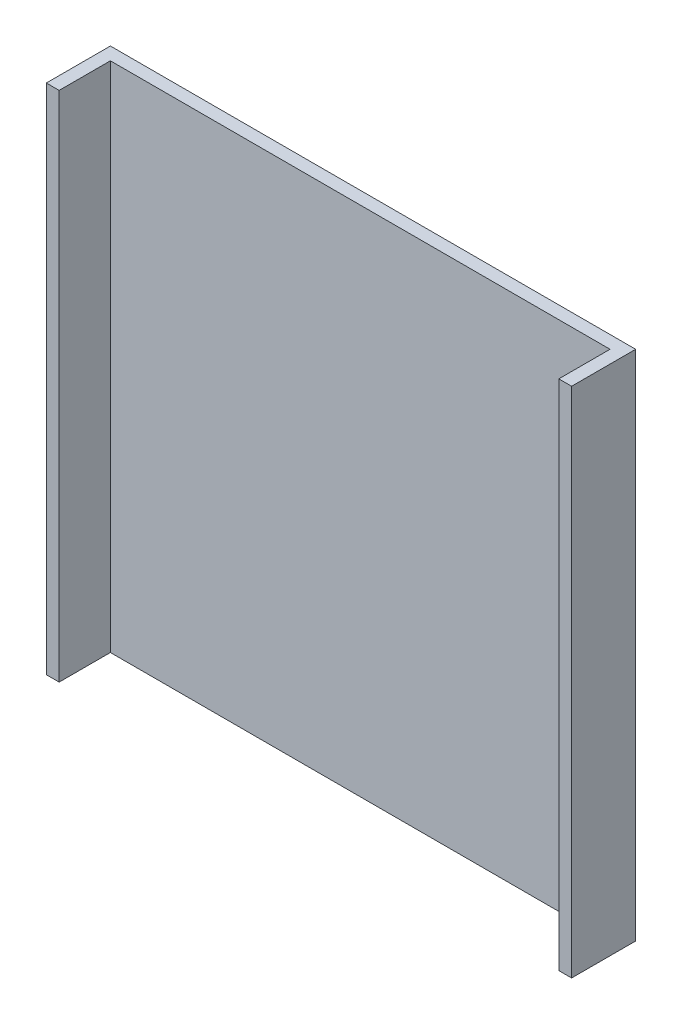
ISO-10303-21;
HEADER;
FILE_DESCRIPTION(('STEP AP214'),'2;1');
FILE_NAME('part.step','',(''),(''),'','','');
FILE_SCHEMA(('AUTOMOTIVE_DESIGN { 1 0 10303 214 1 1 1 1 }'));
ENDSEC;
DATA;
#1=APPLICATION_CONTEXT('core data for automotive mechanical design processes');
#2=APPLICATION_PROTOCOL_DEFINITION('international standard','automotive_design',2000,#1);
#3=PRODUCT_CONTEXT('',#1,'mechanical');
#4=PRODUCT('Part','Part','',(#3));
#5=PRODUCT_RELATED_PRODUCT_CATEGORY('part','',(#4));
#6=PRODUCT_DEFINITION_FORMATION('','',#4);
#7=PRODUCT_DEFINITION_CONTEXT('part definition',#1,'design');
#8=PRODUCT_DEFINITION('design','',#6,#7);
#9=PRODUCT_DEFINITION_SHAPE('','',#8);
#10=(LENGTH_UNIT() NAMED_UNIT(*) SI_UNIT(.MILLI.,.METRE.));
#11=(NAMED_UNIT(*) PLANE_ANGLE_UNIT() SI_UNIT($,.RADIAN.));
#12=(NAMED_UNIT(*) SI_UNIT($,.STERADIAN.) SOLID_ANGLE_UNIT());
#13=UNCERTAINTY_MEASURE_WITH_UNIT(LENGTH_MEASURE(1.E-05),#10,'distance_accuracy_value','');
#14=(GEOMETRIC_REPRESENTATION_CONTEXT(3) GLOBAL_UNCERTAINTY_ASSIGNED_CONTEXT((#13)) GLOBAL_UNIT_ASSIGNED_CONTEXT((#10,
#11,#12)) REPRESENTATION_CONTEXT('',''));
#15=CARTESIAN_POINT('',(0.,0.,0.));
#16=DIRECTION('',(0.,0.,1.));
#17=DIRECTION('',(1.,0.,0.));
#18=AXIS2_PLACEMENT_3D('',#15,#16,#17);
#19=CARTESIAN_POINT('',(0.,0.,6.35));
#20=DIRECTION('',(0.,0.,-1.));
#21=DIRECTION('',(-1.,0.,0.));
#22=AXIS2_PLACEMENT_3D('',#19,#20,#21);
#23=PLANE('',#22);
#24=DIRECTION('',(0.,-1.,0.));
#25=VECTOR('',#24,1.);
#26=CARTESIAN_POINT('',(254.,254.,6.35));
#27=LINE('',#26,#25);
#28=CARTESIAN_POINT('',(254.,254.,6.35));
#29=VERTEX_POINT('',#28);
#30=CARTESIAN_POINT('',(254.,0.,6.35));
#31=VERTEX_POINT('',#30);
#32=EDGE_CURVE('E138',#29,#31,#27,.T.);
#33=ORIENTED_EDGE('',*,*,#32,.F.);
#34=DIRECTION('',(-1.,0.,0.));
#35=VECTOR('',#34,1.);
#36=CARTESIAN_POINT('',(0.,254.,6.35));
#37=LINE('',#36,#35);
#38=CARTESIAN_POINT('',(6.35,254.,6.35));
#39=VERTEX_POINT('',#38);
#40=EDGE_CURVE('E180',#29,#39,#37,.T.);
#41=ORIENTED_EDGE('',*,*,#40,.T.);
#42=DIRECTION('',(0.,1.,0.));
#43=VECTOR('',#42,1.);
#44=CARTESIAN_POINT('',(6.35,254.,6.35));
#45=LINE('',#44,#43);
#46=CARTESIAN_POINT('',(6.35000000000002,0.,6.35));
#47=VERTEX_POINT('',#46);
#48=EDGE_CURVE('E66',#47,#39,#45,.T.);
#49=ORIENTED_EDGE('',*,*,#48,.F.);
#50=DIRECTION('',(1.,0.,0.));
#51=VECTOR('',#50,1.);
#52=CARTESIAN_POINT('',(0.,0.,6.35));
#53=LINE('',#52,#51);
#54=EDGE_CURVE('E61',#47,#31,#53,.T.);
#55=ORIENTED_EDGE('',*,*,#54,.T.);
#56=EDGE_LOOP('',(#33,#41,#49,#55));
#57=FACE_BOUND('',#56,.T.);
#58=ADVANCED_FACE('F45',(#57),#23,.F.);
#59=CARTESIAN_POINT('',(0.,0.,6.35));
#60=DIRECTION('',(1.,0.,0.));
#61=DIRECTION('',(0.,0.,-1.));
#62=AXIS2_PLACEMENT_3D('',#59,#60,#61);
#63=PLANE('',#62);
#64=DIRECTION('',(0.,-1.,0.));
#65=VECTOR('',#64,1.);
#66=CARTESIAN_POINT('',(0.,0.,0.));
#67=LINE('',#66,#65);
#68=CARTESIAN_POINT('',(0.,254.,0.));
#69=VERTEX_POINT('',#68);
#70=CARTESIAN_POINT('',(0.,0.,0.));
#71=VERTEX_POINT('',#70);
#72=EDGE_CURVE('E177',#69,#71,#67,.T.);
#73=ORIENTED_EDGE('',*,*,#72,.T.);
#74=DIRECTION('',(0.,0.,-1.));
#75=VECTOR('',#74,1.);
#76=CARTESIAN_POINT('',(0.,0.,6.35));
#77=LINE('',#76,#75);
#78=CARTESIAN_POINT('',(0.,0.,31.75));
#79=VERTEX_POINT('',#78);
#80=EDGE_CURVE('E11',#79,#71,#77,.T.);
#81=ORIENTED_EDGE('',*,*,#80,.F.);
#82=DIRECTION('',(0.,-1.,0.));
#83=VECTOR('',#82,1.);
#84=CARTESIAN_POINT('',(0.,254.,31.75));
#85=LINE('',#84,#83);
#86=CARTESIAN_POINT('',(0.,254.,31.75));
#87=VERTEX_POINT('',#86);
#88=EDGE_CURVE('E153',#87,#79,#85,.T.);
#89=ORIENTED_EDGE('',*,*,#88,.F.);
#90=DIRECTION('',(0.,0.,-1.));
#91=VECTOR('',#90,1.);
#92=CARTESIAN_POINT('',(0.,254.,6.35));
#93=LINE('',#92,#91);
#94=EDGE_CURVE('E121',#87,#69,#93,.T.);
#95=ORIENTED_EDGE('',*,*,#94,.T.);
#96=EDGE_LOOP('',(#73,#81,#89,#95));
#97=FACE_BOUND('',#96,.T.);
#98=ADVANCED_FACE('F47',(#97),#63,.F.);
#99=CARTESIAN_POINT('',(0.,0.,6.35));
#100=DIRECTION('',(0.,1.,0.));
#101=DIRECTION('',(0.,0.,1.));
#102=AXIS2_PLACEMENT_3D('',#99,#100,#101);
#103=PLANE('',#102);
#104=DIRECTION('',(1.,0.,0.));
#105=VECTOR('',#104,1.);
#106=CARTESIAN_POINT('',(0.,0.,0.));
#107=LINE('',#106,#105);
#108=CARTESIAN_POINT('',(260.35,0.,0.));
#109=VERTEX_POINT('',#108);
#110=EDGE_CURVE('E187',#71,#109,#107,.T.);
#111=ORIENTED_EDGE('',*,*,#110,.T.);
#112=DIRECTION('',(0.,0.,-1.));
#113=VECTOR('',#112,1.);
#114=CARTESIAN_POINT('',(260.35,0.,6.35));
#115=LINE('',#114,#113);
#116=CARTESIAN_POINT('',(260.35,0.,31.75));
#117=VERTEX_POINT('',#116);
#118=EDGE_CURVE('E54',#117,#109,#115,.T.);
#119=ORIENTED_EDGE('',*,*,#118,.F.);
#120=DIRECTION('',(1.,0.,0.));
#121=VECTOR('',#120,1.);
#122=CARTESIAN_POINT('',(260.35,0.,31.75));
#123=LINE('',#122,#121);
#124=CARTESIAN_POINT('',(254.,0.,31.75));
#125=VERTEX_POINT('',#124);
#126=EDGE_CURVE('E136',#125,#117,#123,.T.);
#127=ORIENTED_EDGE('',*,*,#126,.F.);
#128=DIRECTION('',(0.,0.,-1.));
#129=VECTOR('',#128,1.);
#130=CARTESIAN_POINT('',(254.,0.,31.75));
#131=LINE('',#130,#129);
#132=EDGE_CURVE('E146',#125,#31,#131,.T.);
#133=ORIENTED_EDGE('',*,*,#132,.T.);
#134=ORIENTED_EDGE('',*,*,#54,.F.);
#135=DIRECTION('',(0.,0.,-1.));
#136=VECTOR('',#135,1.);
#137=CARTESIAN_POINT('',(6.35000000000003,0.,31.75));
#138=LINE('',#137,#136);
#139=CARTESIAN_POINT('',(6.35000000000003,0.,31.75));
#140=VERTEX_POINT('',#139);
#141=EDGE_CURVE('E173',#140,#47,#138,.T.);
#142=ORIENTED_EDGE('',*,*,#141,.F.);
#143=DIRECTION('',(1.,0.,0.));
#144=VECTOR('',#143,1.);
#145=CARTESIAN_POINT('',(0.,0.,31.75));
#146=LINE('',#145,#144);
#147=EDGE_CURVE('E157',#79,#140,#146,.T.);
#148=ORIENTED_EDGE('',*,*,#147,.F.);
#149=ORIENTED_EDGE('',*,*,#80,.T.);
#150=EDGE_LOOP('',(#111,#119,#127,#133,#134,#142,#148,#149));
#151=FACE_BOUND('',#150,.T.);
#152=ADVANCED_FACE('F212',(#151),#103,.F.);
#153=CARTESIAN_POINT('',(260.35,0.,6.35));
#154=DIRECTION('',(-1.,0.,0.));
#155=DIRECTION('',(0.,0.,1.));
#156=AXIS2_PLACEMENT_3D('',#153,#154,#155);
#157=PLANE('',#156);
#158=DIRECTION('',(0.,1.,0.));
#159=VECTOR('',#158,1.);
#160=CARTESIAN_POINT('',(260.35,0.,0.));
#161=LINE('',#160,#159);
#162=CARTESIAN_POINT('',(260.35,254.,0.));
#163=VERTEX_POINT('',#162);
#164=EDGE_CURVE('E117',#109,#163,#161,.T.);
#165=ORIENTED_EDGE('',*,*,#164,.T.);
#166=DIRECTION('',(0.,0.,-1.));
#167=VECTOR('',#166,1.);
#168=CARTESIAN_POINT('',(260.35,254.,6.35));
#169=LINE('',#168,#167);
#170=CARTESIAN_POINT('',(260.35,254.,31.75));
#171=VERTEX_POINT('',#170);
#172=EDGE_CURVE('E110',#171,#163,#169,.T.);
#173=ORIENTED_EDGE('',*,*,#172,.F.);
#174=DIRECTION('',(0.,1.,0.));
#175=VECTOR('',#174,1.);
#176=CARTESIAN_POINT('',(260.35,254.,31.75));
#177=LINE('',#176,#175);
#178=EDGE_CURVE('E115',#117,#171,#177,.T.);
#179=ORIENTED_EDGE('',*,*,#178,.F.);
#180=ORIENTED_EDGE('',*,*,#118,.T.);
#181=EDGE_LOOP('',(#165,#173,#179,#180));
#182=FACE_BOUND('',#181,.T.);
#183=ADVANCED_FACE('F112',(#182),#157,.F.);
#184=CARTESIAN_POINT('',(0.,254.,6.35));
#185=DIRECTION('',(0.,-1.,0.));
#186=DIRECTION('',(0.,0.,-1.));
#187=AXIS2_PLACEMENT_3D('',#184,#185,#186);
#188=PLANE('',#187);
#189=DIRECTION('',(-1.,0.,0.));
#190=VECTOR('',#189,1.);
#191=CARTESIAN_POINT('',(0.,254.,0.));
#192=LINE('',#191,#190);
#193=EDGE_CURVE('E181',#163,#69,#192,.T.);
#194=ORIENTED_EDGE('',*,*,#193,.T.);
#195=ORIENTED_EDGE('',*,*,#94,.F.);
#196=DIRECTION('',(-1.,0.,0.));
#197=VECTOR('',#196,1.);
#198=CARTESIAN_POINT('',(0.,254.,31.75));
#199=LINE('',#198,#197);
#200=CARTESIAN_POINT('',(6.35,254.,31.75));
#201=VERTEX_POINT('',#200);
#202=EDGE_CURVE('E163',#201,#87,#199,.T.);
#203=ORIENTED_EDGE('',*,*,#202,.F.);
#204=DIRECTION('',(0.,0.,-1.));
#205=VECTOR('',#204,1.);
#206=CARTESIAN_POINT('',(6.35,254.,31.75));
#207=LINE('',#206,#205);
#208=EDGE_CURVE('E167',#201,#39,#207,.T.);
#209=ORIENTED_EDGE('',*,*,#208,.T.);
#210=ORIENTED_EDGE('',*,*,#40,.F.);
#211=DIRECTION('',(0.,0.,-1.));
#212=VECTOR('',#211,1.);
#213=CARTESIAN_POINT('',(254.,254.,31.75));
#214=LINE('',#213,#212);
#215=CARTESIAN_POINT('',(254.,254.,31.75));
#216=VERTEX_POINT('',#215);
#217=EDGE_CURVE('E127',#216,#29,#214,.T.);
#218=ORIENTED_EDGE('',*,*,#217,.F.);
#219=DIRECTION('',(-1.,0.,0.));
#220=VECTOR('',#219,1.);
#221=CARTESIAN_POINT('',(260.35,254.,31.75));
#222=LINE('',#221,#220);
#223=EDGE_CURVE('E124',#171,#216,#222,.T.);
#224=ORIENTED_EDGE('',*,*,#223,.F.);
#225=ORIENTED_EDGE('',*,*,#172,.T.);
#226=EDGE_LOOP('',(#194,#195,#203,#209,#210,#218,#224,#225));
#227=FACE_BOUND('',#226,.T.);
#228=ADVANCED_FACE('F125',(#227),#188,.F.);
#229=CARTESIAN_POINT('',(0.,0.,0.));
#230=DIRECTION('',(0.,0.,-1.));
#231=DIRECTION('',(-1.,0.,0.));
#232=AXIS2_PLACEMENT_3D('',#229,#230,#231);
#233=PLANE('',#232);
#234=ORIENTED_EDGE('',*,*,#72,.F.);
#235=ORIENTED_EDGE('',*,*,#193,.F.);
#236=ORIENTED_EDGE('',*,*,#164,.F.);
#237=ORIENTED_EDGE('',*,*,#110,.F.);
#238=EDGE_LOOP('',(#234,#235,#236,#237));
#239=FACE_BOUND('',#238,.T.);
#240=ADVANCED_FACE('F200',(#239),#233,.T.);
#241=CARTESIAN_POINT('',(6.35,254.,31.75));
#242=DIRECTION('',(-1.,0.,0.));
#243=DIRECTION('',(0.,-1.,0.));
#244=AXIS2_PLACEMENT_3D('',#241,#242,#243);
#245=PLANE('',#244);
#246=ORIENTED_EDGE('',*,*,#48,.T.);
#247=ORIENTED_EDGE('',*,*,#208,.F.);
#248=DIRECTION('',(0.,1.,0.));
#249=VECTOR('',#248,1.);
#250=CARTESIAN_POINT('',(6.35,254.,31.75));
#251=LINE('',#250,#249);
#252=EDGE_CURVE('E160',#140,#201,#251,.T.);
#253=ORIENTED_EDGE('',*,*,#252,.F.);
#254=ORIENTED_EDGE('',*,*,#141,.T.);
#255=EDGE_LOOP('',(#246,#247,#253,#254));
#256=FACE_BOUND('',#255,.T.);
#257=ADVANCED_FACE('F211',(#256),#245,.F.);
#258=CARTESIAN_POINT('',(0.,0.,31.75));
#259=DIRECTION('',(0.,0.,1.));
#260=DIRECTION('',(1.,0.,0.));
#261=AXIS2_PLACEMENT_3D('',#258,#259,#260);
#262=PLANE('',#261);
#263=ORIENTED_EDGE('',*,*,#88,.T.);
#264=ORIENTED_EDGE('',*,*,#147,.T.);
#265=ORIENTED_EDGE('',*,*,#252,.T.);
#266=ORIENTED_EDGE('',*,*,#202,.T.);
#267=EDGE_LOOP('',(#263,#264,#265,#266));
#268=FACE_BOUND('',#267,.T.);
#269=ADVANCED_FACE('F206',(#268),#262,.T.);
#270=CARTESIAN_POINT('',(254.,254.,31.75));
#271=DIRECTION('',(1.,0.,0.));
#272=DIRECTION('',(0.,0.,-1.));
#273=AXIS2_PLACEMENT_3D('',#270,#271,#272);
#274=PLANE('',#273);
#275=ORIENTED_EDGE('',*,*,#32,.T.);
#276=ORIENTED_EDGE('',*,*,#132,.F.);
#277=DIRECTION('',(0.,-1.,0.));
#278=VECTOR('',#277,1.);
#279=CARTESIAN_POINT('',(254.,254.,31.75));
#280=LINE('',#279,#278);
#281=EDGE_CURVE('E131',#216,#125,#280,.T.);
#282=ORIENTED_EDGE('',*,*,#281,.F.);
#283=ORIENTED_EDGE('',*,*,#217,.T.);
#284=EDGE_LOOP('',(#275,#276,#282,#283));
#285=FACE_BOUND('',#284,.T.);
#286=ADVANCED_FACE('F215',(#285),#274,.F.);
#287=CARTESIAN_POINT('',(0.,0.,31.75));
#288=DIRECTION('',(0.,0.,-1.));
#289=DIRECTION('',(-1.,0.,0.));
#290=AXIS2_PLACEMENT_3D('',#287,#288,#289);
#291=PLANE('',#290);
#292=ORIENTED_EDGE('',*,*,#178,.T.);
#293=ORIENTED_EDGE('',*,*,#223,.T.);
#294=ORIENTED_EDGE('',*,*,#281,.T.);
#295=ORIENTED_EDGE('',*,*,#126,.T.);
#296=EDGE_LOOP('',(#292,#293,#294,#295));
#297=FACE_BOUND('',#296,.T.);
#298=ADVANCED_FACE('F134',(#297),#291,.F.);
#299=CLOSED_SHELL('',(#58,#98,#152,#183,#228,#240,#257,#269,#286,#298));
#300=MANIFOLD_SOLID_BREP('B2',#299);
#301=ADVANCED_BREP_SHAPE_REPRESENTATION('',(#18,#300),#14);
#302=SHAPE_DEFINITION_REPRESENTATION(#9,#301);
ENDSEC;
END-ISO-10303-21;
